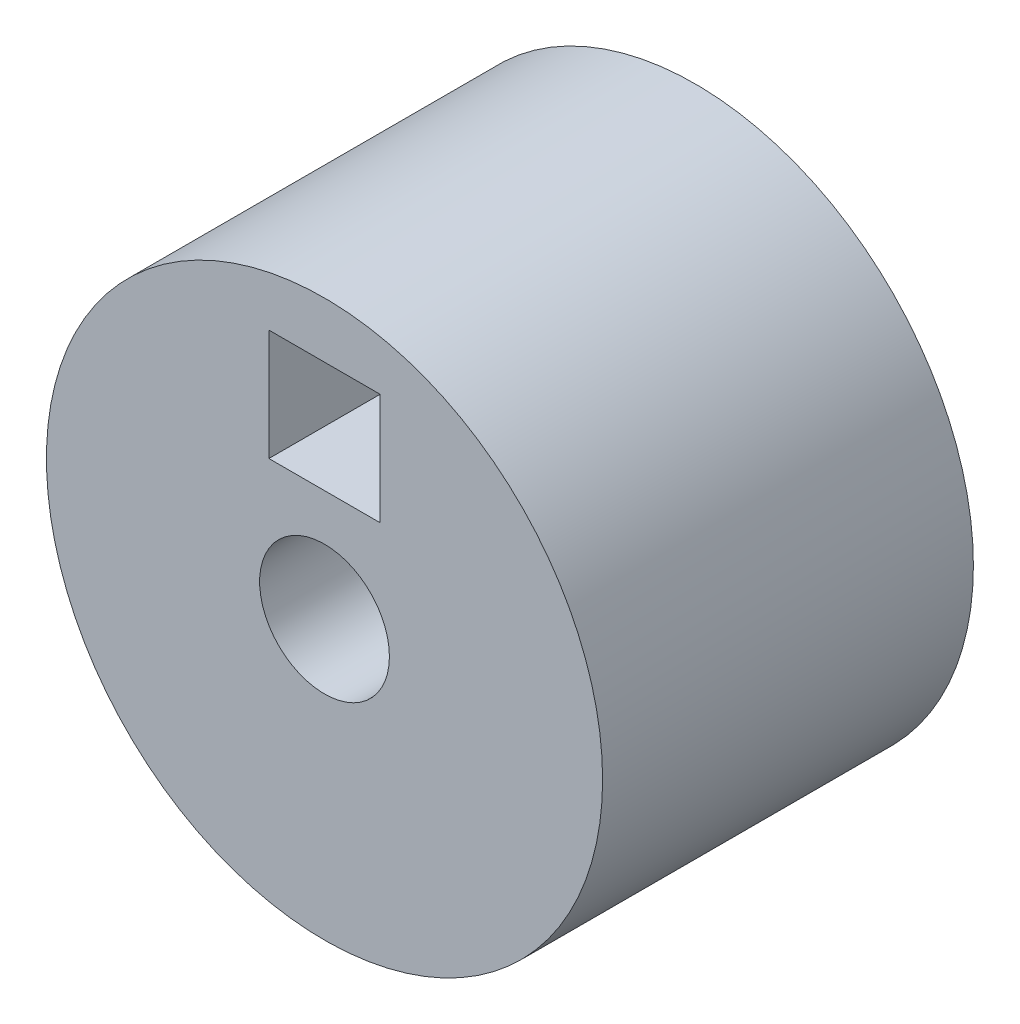
ISO-10303-21;
HEADER;
FILE_DESCRIPTION(('STEP AP214'),'2;1');
FILE_NAME('part.step','',(''),(''),'','','');
FILE_SCHEMA(('AUTOMOTIVE_DESIGN { 1 0 10303 214 1 1 1 1 }'));
ENDSEC;
DATA;
#1=APPLICATION_CONTEXT('core data for automotive mechanical design processes');
#2=APPLICATION_PROTOCOL_DEFINITION('international standard','automotive_design',2000,#1);
#3=PRODUCT_CONTEXT('',#1,'mechanical');
#4=PRODUCT('Part','Part','',(#3));
#5=PRODUCT_RELATED_PRODUCT_CATEGORY('part','',(#4));
#6=PRODUCT_DEFINITION_FORMATION('','',#4);
#7=PRODUCT_DEFINITION_CONTEXT('part definition',#1,'design');
#8=PRODUCT_DEFINITION('design','',#6,#7);
#9=PRODUCT_DEFINITION_SHAPE('','',#8);
#10=(LENGTH_UNIT() NAMED_UNIT(*) SI_UNIT(.MILLI.,.METRE.));
#11=(NAMED_UNIT(*) PLANE_ANGLE_UNIT() SI_UNIT($,.RADIAN.));
#12=(NAMED_UNIT(*) SI_UNIT($,.STERADIAN.) SOLID_ANGLE_UNIT());
#13=UNCERTAINTY_MEASURE_WITH_UNIT(LENGTH_MEASURE(1.E-05),#10,'distance_accuracy_value','');
#14=(GEOMETRIC_REPRESENTATION_CONTEXT(3) GLOBAL_UNCERTAINTY_ASSIGNED_CONTEXT((#13)) GLOBAL_UNIT_ASSIGNED_CONTEXT((#10,
#11,#12)) REPRESENTATION_CONTEXT('',''));
#15=CARTESIAN_POINT('',(0.,0.,0.));
#16=DIRECTION('',(0.,0.,1.));
#17=DIRECTION('',(1.,0.,0.));
#18=AXIS2_PLACEMENT_3D('',#15,#16,#17);
#19=CARTESIAN_POINT('',(0.,0.,10.));
#20=DIRECTION('',(0.,0.,1.));
#21=DIRECTION('',(1.,0.,0.));
#22=AXIS2_PLACEMENT_3D('',#19,#20,#21);
#23=PLANE('',#22);
#24=DIRECTION('',(0.,1.,0.));
#25=VECTOR('',#24,1.);
#26=CARTESIAN_POINT('',(-1.5,3.,10.));
#27=LINE('',#26,#25);
#28=CARTESIAN_POINT('',(-1.5,3.,10.));
#29=VERTEX_POINT('',#28);
#30=CARTESIAN_POINT('',(-1.5,6.,10.));
#31=VERTEX_POINT('',#30);
#32=EDGE_CURVE('E82',#29,#31,#27,.T.);
#33=ORIENTED_EDGE('',*,*,#32,.T.);
#34=DIRECTION('',(1.,0.,0.));
#35=VECTOR('',#34,1.);
#36=CARTESIAN_POINT('',(1.5,6.,10.));
#37=LINE('',#36,#35);
#38=CARTESIAN_POINT('',(1.5,6.,10.));
#39=VERTEX_POINT('',#38);
#40=EDGE_CURVE('E91',#31,#39,#37,.T.);
#41=ORIENTED_EDGE('',*,*,#40,.T.);
#42=DIRECTION('',(0.,-1.,0.));
#43=VECTOR('',#42,1.);
#44=CARTESIAN_POINT('',(1.5,3.,10.));
#45=LINE('',#44,#43);
#46=CARTESIAN_POINT('',(1.5,3.,10.));
#47=VERTEX_POINT('',#46);
#48=EDGE_CURVE('E54',#39,#47,#45,.T.);
#49=ORIENTED_EDGE('',*,*,#48,.T.);
#50=DIRECTION('',(-1.,0.,0.));
#51=VECTOR('',#50,1.);
#52=CARTESIAN_POINT('',(1.5,3.,10.));
#53=LINE('',#52,#51);
#54=EDGE_CURVE('E88',#47,#29,#53,.T.);
#55=ORIENTED_EDGE('',*,*,#54,.T.);
#56=EDGE_LOOP('',(#33,#41,#49,#55));
#57=FACE_BOUND('',#56,.T.);
#58=CARTESIAN_POINT('',(0.,0.,10.));
#59=DIRECTION('',(0.,0.,1.));
#60=DIRECTION('',(1.,0.,0.));
#61=AXIS2_PLACEMENT_3D('',#58,#59,#60);
#62=CIRCLE('',#61,7.5);
#63=CARTESIAN_POINT('',(7.5,0.,10.));
#64=VERTEX_POINT('',#63);
#65=EDGE_CURVE('E11',#64,#64,#62,.T.);
#66=ORIENTED_EDGE('',*,*,#65,.T.);
#67=EDGE_LOOP('',(#66));
#68=FACE_BOUND('',#67,.T.);
#69=CARTESIAN_POINT('',(0.,0.,10.));
#70=DIRECTION('',(0.,0.,1.));
#71=DIRECTION('',(1.,0.,0.));
#72=AXIS2_PLACEMENT_3D('',#69,#70,#71);
#73=CIRCLE('',#72,1.75);
#74=CARTESIAN_POINT('',(1.75,0.,10.));
#75=VERTEX_POINT('',#74);
#76=EDGE_CURVE('E116',#75,#75,#73,.T.);
#77=ORIENTED_EDGE('',*,*,#76,.F.);
#78=EDGE_LOOP('',(#77));
#79=FACE_BOUND('',#78,.T.);
#80=ADVANCED_FACE('F39',(#57,#68,#79),#23,.T.);
#81=CARTESIAN_POINT('',(0.,0.,0.));
#82=DIRECTION('',(0.,0.,1.));
#83=DIRECTION('',(1.,0.,0.));
#84=AXIS2_PLACEMENT_3D('',#81,#82,#83);
#85=PLANE('',#84);
#86=DIRECTION('',(1.,0.,0.));
#87=VECTOR('',#86,1.);
#88=CARTESIAN_POINT('',(1.5,6.,0.));
#89=LINE('',#88,#87);
#90=CARTESIAN_POINT('',(-1.5,6.,0.));
#91=VERTEX_POINT('',#90);
#92=CARTESIAN_POINT('',(1.5,6.,0.));
#93=VERTEX_POINT('',#92);
#94=EDGE_CURVE('E106',#91,#93,#89,.T.);
#95=ORIENTED_EDGE('',*,*,#94,.F.);
#96=DIRECTION('',(0.,1.,0.));
#97=VECTOR('',#96,1.);
#98=CARTESIAN_POINT('',(-1.5,3.,0.));
#99=LINE('',#98,#97);
#100=CARTESIAN_POINT('',(-1.5,3.,0.));
#101=VERTEX_POINT('',#100);
#102=EDGE_CURVE('E62',#101,#91,#99,.T.);
#103=ORIENTED_EDGE('',*,*,#102,.F.);
#104=DIRECTION('',(-1.,0.,0.));
#105=VECTOR('',#104,1.);
#106=CARTESIAN_POINT('',(1.5,3.,0.));
#107=LINE('',#106,#105);
#108=CARTESIAN_POINT('',(1.5,3.,0.));
#109=VERTEX_POINT('',#108);
#110=EDGE_CURVE('E97',#109,#101,#107,.T.);
#111=ORIENTED_EDGE('',*,*,#110,.F.);
#112=DIRECTION('',(0.,-1.,0.));
#113=VECTOR('',#112,1.);
#114=CARTESIAN_POINT('',(1.5,3.,0.));
#115=LINE('',#114,#113);
#116=EDGE_CURVE('E100',#93,#109,#115,.T.);
#117=ORIENTED_EDGE('',*,*,#116,.F.);
#118=EDGE_LOOP('',(#95,#103,#111,#117));
#119=FACE_BOUND('',#118,.T.);
#120=CARTESIAN_POINT('',(0.,0.,0.));
#121=DIRECTION('',(0.,0.,1.));
#122=DIRECTION('',(1.,0.,0.));
#123=AXIS2_PLACEMENT_3D('',#120,#121,#122);
#124=CIRCLE('',#123,7.5);
#125=CARTESIAN_POINT('',(7.5,0.,0.));
#126=VERTEX_POINT('',#125);
#127=EDGE_CURVE('E43',#126,#126,#124,.T.);
#128=ORIENTED_EDGE('',*,*,#127,.F.);
#129=EDGE_LOOP('',(#128));
#130=FACE_BOUND('',#129,.T.);
#131=CARTESIAN_POINT('',(0.,0.,0.));
#132=DIRECTION('',(0.,0.,1.));
#133=DIRECTION('',(1.,0.,0.));
#134=AXIS2_PLACEMENT_3D('',#131,#132,#133);
#135=CIRCLE('',#134,1.75);
#136=CARTESIAN_POINT('',(1.75,0.,0.));
#137=VERTEX_POINT('',#136);
#138=EDGE_CURVE('E112',#137,#137,#135,.T.);
#139=ORIENTED_EDGE('',*,*,#138,.T.);
#140=EDGE_LOOP('',(#139));
#141=FACE_BOUND('',#140,.T.);
#142=ADVANCED_FACE('F122',(#119,#130,#141),#85,.F.);
#143=CARTESIAN_POINT('',(0.,0.,10.));
#144=DIRECTION('',(0.,0.,-1.));
#145=DIRECTION('',(-1.,0.,0.));
#146=AXIS2_PLACEMENT_3D('',#143,#144,#145);
#147=CYLINDRICAL_SURFACE('',#146,7.5);
#148=ORIENTED_EDGE('',*,*,#65,.F.);
#149=EDGE_LOOP('',(#148));
#150=FACE_BOUND('',#149,.T.);
#151=ORIENTED_EDGE('',*,*,#127,.T.);
#152=EDGE_LOOP('',(#151));
#153=FACE_BOUND('',#152,.T.);
#154=ADVANCED_FACE('F41',(#150,#153),#147,.T.);
#155=CARTESIAN_POINT('',(0.,0.,10.));
#156=DIRECTION('',(0.,0.,-1.));
#157=DIRECTION('',(-1.,0.,0.));
#158=AXIS2_PLACEMENT_3D('',#155,#156,#157);
#159=CYLINDRICAL_SURFACE('',#158,1.75);
#160=ORIENTED_EDGE('',*,*,#76,.T.);
#161=EDGE_LOOP('',(#160));
#162=FACE_BOUND('',#161,.T.);
#163=ORIENTED_EDGE('',*,*,#138,.F.);
#164=EDGE_LOOP('',(#163));
#165=FACE_BOUND('',#164,.T.);
#166=ADVANCED_FACE('F124',(#162,#165),#159,.F.);
#167=CARTESIAN_POINT('',(-1.5,3.,10.));
#168=DIRECTION('',(-1.,0.,0.));
#169=DIRECTION('',(0.,0.,1.));
#170=AXIS2_PLACEMENT_3D('',#167,#168,#169);
#171=PLANE('',#170);
#172=ORIENTED_EDGE('',*,*,#102,.T.);
#173=DIRECTION('',(0.,0.,-1.));
#174=VECTOR('',#173,1.);
#175=CARTESIAN_POINT('',(-1.5,6.,10.));
#176=LINE('',#175,#174);
#177=EDGE_CURVE('E78',#31,#91,#176,.T.);
#178=ORIENTED_EDGE('',*,*,#177,.F.);
#179=ORIENTED_EDGE('',*,*,#32,.F.);
#180=DIRECTION('',(0.,0.,-1.));
#181=VECTOR('',#180,1.);
#182=CARTESIAN_POINT('',(-1.5,3.,10.));
#183=LINE('',#182,#181);
#184=EDGE_CURVE('E110',#29,#101,#183,.T.);
#185=ORIENTED_EDGE('',*,*,#184,.T.);
#186=EDGE_LOOP('',(#172,#178,#179,#185));
#187=FACE_BOUND('',#186,.T.);
#188=ADVANCED_FACE('F80',(#187),#171,.F.);
#189=CARTESIAN_POINT('',(1.5,3.,10.));
#190=DIRECTION('',(0.,-1.,0.));
#191=DIRECTION('',(0.,0.,-1.));
#192=AXIS2_PLACEMENT_3D('',#189,#190,#191);
#193=PLANE('',#192);
#194=ORIENTED_EDGE('',*,*,#110,.T.);
#195=ORIENTED_EDGE('',*,*,#184,.F.);
#196=ORIENTED_EDGE('',*,*,#54,.F.);
#197=DIRECTION('',(0.,0.,-1.));
#198=VECTOR('',#197,1.);
#199=CARTESIAN_POINT('',(1.5,3.,10.));
#200=LINE('',#199,#198);
#201=EDGE_CURVE('E113',#47,#109,#200,.T.);
#202=ORIENTED_EDGE('',*,*,#201,.T.);
#203=EDGE_LOOP('',(#194,#195,#196,#202));
#204=FACE_BOUND('',#203,.T.);
#205=ADVANCED_FACE('F133',(#204),#193,.F.);
#206=CARTESIAN_POINT('',(1.5,3.,10.));
#207=DIRECTION('',(1.,0.,0.));
#208=DIRECTION('',(0.,0.,-1.));
#209=AXIS2_PLACEMENT_3D('',#206,#207,#208);
#210=PLANE('',#209);
#211=ORIENTED_EDGE('',*,*,#116,.T.);
#212=ORIENTED_EDGE('',*,*,#201,.F.);
#213=ORIENTED_EDGE('',*,*,#48,.F.);
#214=DIRECTION('',(0.,0.,-1.));
#215=VECTOR('',#214,1.);
#216=CARTESIAN_POINT('',(1.5,6.,10.));
#217=LINE('',#216,#215);
#218=EDGE_CURVE('E87',#39,#93,#217,.T.);
#219=ORIENTED_EDGE('',*,*,#218,.T.);
#220=EDGE_LOOP('',(#211,#212,#213,#219));
#221=FACE_BOUND('',#220,.T.);
#222=ADVANCED_FACE('F149',(#221),#210,.F.);
#223=CARTESIAN_POINT('',(1.5,6.,10.));
#224=DIRECTION('',(0.,1.,0.));
#225=DIRECTION('',(0.,0.,1.));
#226=AXIS2_PLACEMENT_3D('',#223,#224,#225);
#227=PLANE('',#226);
#228=ORIENTED_EDGE('',*,*,#94,.T.);
#229=ORIENTED_EDGE('',*,*,#218,.F.);
#230=ORIENTED_EDGE('',*,*,#40,.F.);
#231=ORIENTED_EDGE('',*,*,#177,.T.);
#232=EDGE_LOOP('',(#228,#229,#230,#231));
#233=FACE_BOUND('',#232,.T.);
#234=ADVANCED_FACE('F92',(#233),#227,.F.);
#235=CLOSED_SHELL('',(#80,#142,#154,#166,#188,#205,#222,#234));
#236=MANIFOLD_SOLID_BREP('B2',#235);
#237=ADVANCED_BREP_SHAPE_REPRESENTATION('',(#18,#236),#14);
#238=SHAPE_DEFINITION_REPRESENTATION(#9,#237);
ENDSEC;
END-ISO-10303-21;
